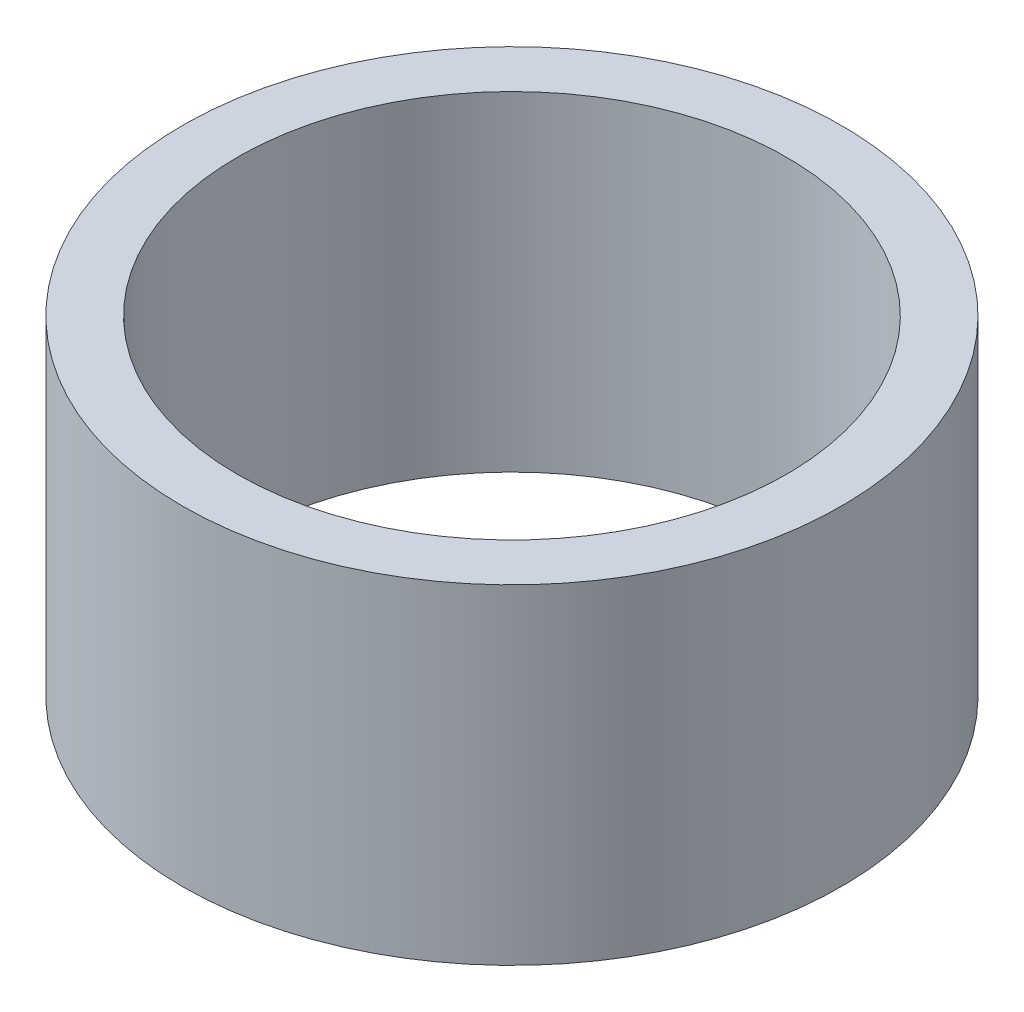
ISO-10303-21;
HEADER;
FILE_DESCRIPTION(('STEP AP214'),'2;1');
FILE_NAME('part.step','',(''),(''),'','','');
FILE_SCHEMA(('AUTOMOTIVE_DESIGN { 1 0 10303 214 1 1 1 1 }'));
ENDSEC;
DATA;
#1=APPLICATION_CONTEXT('core data for automotive mechanical design processes');
#2=APPLICATION_PROTOCOL_DEFINITION('international standard','automotive_design',2000,#1);
#3=PRODUCT_CONTEXT('',#1,'mechanical');
#4=PRODUCT('Part','Part','',(#3));
#5=PRODUCT_RELATED_PRODUCT_CATEGORY('part','',(#4));
#6=PRODUCT_DEFINITION_FORMATION('','',#4);
#7=PRODUCT_DEFINITION_CONTEXT('part definition',#1,'design');
#8=PRODUCT_DEFINITION('design','',#6,#7);
#9=PRODUCT_DEFINITION_SHAPE('','',#8);
#10=(LENGTH_UNIT() NAMED_UNIT(*) SI_UNIT(.MILLI.,.METRE.));
#11=(NAMED_UNIT(*) PLANE_ANGLE_UNIT() SI_UNIT($,.RADIAN.));
#12=(NAMED_UNIT(*) SI_UNIT($,.STERADIAN.) SOLID_ANGLE_UNIT());
#13=UNCERTAINTY_MEASURE_WITH_UNIT(LENGTH_MEASURE(1.E-05),#10,'distance_accuracy_value','');
#14=(GEOMETRIC_REPRESENTATION_CONTEXT(3) GLOBAL_UNCERTAINTY_ASSIGNED_CONTEXT((#13)) GLOBAL_UNIT_ASSIGNED_CONTEXT((#10,
#11,#12)) REPRESENTATION_CONTEXT('',''));
#15=CARTESIAN_POINT('',(0.,0.,0.));
#16=DIRECTION('',(0.,0.,1.));
#17=DIRECTION('',(1.,0.,0.));
#18=AXIS2_PLACEMENT_3D('',#15,#16,#17);
#19=CARTESIAN_POINT('',(0.,6.,0.));
#20=DIRECTION('',(0.,1.,0.));
#21=DIRECTION('',(0.,0.,1.));
#22=AXIS2_PLACEMENT_3D('',#19,#20,#21);
#23=PLANE('',#22);
#24=CARTESIAN_POINT('',(0.,6.,0.));
#25=DIRECTION('',(0.,1.,0.));
#26=DIRECTION('',(0.,0.,1.));
#27=AXIS2_PLACEMENT_3D('',#24,#25,#26);
#28=CIRCLE('',#27,6.);
#29=CARTESIAN_POINT('',(0.,6.,6.));
#30=VERTEX_POINT('',#29);
#31=EDGE_CURVE('E10',#30,#30,#28,.T.);
#32=ORIENTED_EDGE('',*,*,#31,.T.);
#33=EDGE_LOOP('',(#32));
#34=FACE_BOUND('',#33,.T.);
#35=CARTESIAN_POINT('',(0.,6.,0.));
#36=DIRECTION('',(0.,1.,0.));
#37=DIRECTION('',(0.,0.,1.));
#38=AXIS2_PLACEMENT_3D('',#35,#36,#37);
#39=CIRCLE('',#38,5.);
#40=CARTESIAN_POINT('',(0.,6.,5.));
#41=VERTEX_POINT('',#40);
#42=EDGE_CURVE('E48',#41,#41,#39,.T.);
#43=ORIENTED_EDGE('',*,*,#42,.F.);
#44=EDGE_LOOP('',(#43));
#45=FACE_BOUND('',#44,.T.);
#46=ADVANCED_FACE('F37',(#34,#45),#23,.T.);
#47=CARTESIAN_POINT('',(0.,0.,0.));
#48=DIRECTION('',(0.,1.,0.));
#49=DIRECTION('',(0.,0.,1.));
#50=AXIS2_PLACEMENT_3D('',#47,#48,#49);
#51=PLANE('',#50);
#52=CARTESIAN_POINT('',(0.,0.,0.));
#53=DIRECTION('',(0.,1.,0.));
#54=DIRECTION('',(0.,0.,1.));
#55=AXIS2_PLACEMENT_3D('',#52,#53,#54);
#56=CIRCLE('',#55,6.);
#57=CARTESIAN_POINT('',(0.,0.,6.));
#58=VERTEX_POINT('',#57);
#59=EDGE_CURVE('E41',#58,#58,#56,.T.);
#60=ORIENTED_EDGE('',*,*,#59,.F.);
#61=EDGE_LOOP('',(#60));
#62=FACE_BOUND('',#61,.T.);
#63=CARTESIAN_POINT('',(0.,0.,0.));
#64=DIRECTION('',(0.,1.,0.));
#65=DIRECTION('',(0.,0.,1.));
#66=AXIS2_PLACEMENT_3D('',#63,#64,#65);
#67=CIRCLE('',#66,5.);
#68=CARTESIAN_POINT('',(0.,0.,5.));
#69=VERTEX_POINT('',#68);
#70=EDGE_CURVE('E50',#69,#69,#67,.T.);
#71=ORIENTED_EDGE('',*,*,#70,.T.);
#72=EDGE_LOOP('',(#71));
#73=FACE_BOUND('',#72,.T.);
#74=ADVANCED_FACE('F60',(#62,#73),#51,.F.);
#75=CARTESIAN_POINT('',(0.,6.,0.));
#76=DIRECTION('',(0.,-1.,0.));
#77=DIRECTION('',(0.,0.,-1.));
#78=AXIS2_PLACEMENT_3D('',#75,#76,#77);
#79=CYLINDRICAL_SURFACE('',#78,6.);
#80=ORIENTED_EDGE('',*,*,#31,.F.);
#81=EDGE_LOOP('',(#80));
#82=FACE_BOUND('',#81,.T.);
#83=ORIENTED_EDGE('',*,*,#59,.T.);
#84=EDGE_LOOP('',(#83));
#85=FACE_BOUND('',#84,.T.);
#86=ADVANCED_FACE('F39',(#82,#85),#79,.T.);
#87=CARTESIAN_POINT('',(0.,6.,0.));
#88=DIRECTION('',(0.,-1.,0.));
#89=DIRECTION('',(0.,0.,-1.));
#90=AXIS2_PLACEMENT_3D('',#87,#88,#89);
#91=CYLINDRICAL_SURFACE('',#90,5.);
#92=ORIENTED_EDGE('',*,*,#42,.T.);
#93=EDGE_LOOP('',(#92));
#94=FACE_BOUND('',#93,.T.);
#95=ORIENTED_EDGE('',*,*,#70,.F.);
#96=EDGE_LOOP('',(#95));
#97=FACE_BOUND('',#96,.T.);
#98=ADVANCED_FACE('F56',(#94,#97),#91,.F.);
#99=CLOSED_SHELL('',(#46,#74,#86,#98));
#100=MANIFOLD_SOLID_BREP('B2',#99);
#101=ADVANCED_BREP_SHAPE_REPRESENTATION('',(#18,#100),#14);
#102=SHAPE_DEFINITION_REPRESENTATION(#9,#101);
ENDSEC;
END-ISO-10303-21;
